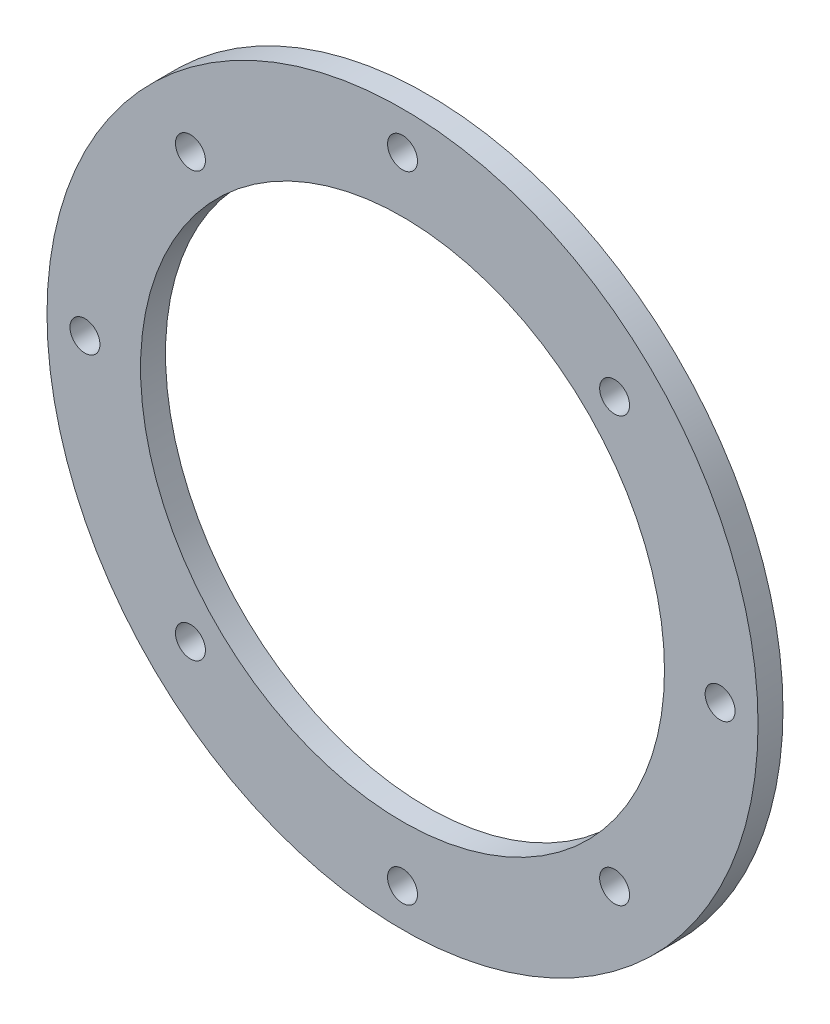
ISO-10303-21;
HEADER;
FILE_DESCRIPTION(('STEP AP214'),'2;1');
FILE_NAME('part.step','',(''),(''),'','','');
FILE_SCHEMA(('AUTOMOTIVE_DESIGN { 1 0 10303 214 1 1 1 1 }'));
ENDSEC;
DATA;
#1=APPLICATION_CONTEXT('core data for automotive mechanical design processes');
#2=APPLICATION_PROTOCOL_DEFINITION('international standard','automotive_design',2000,#1);
#3=PRODUCT_CONTEXT('',#1,'mechanical');
#4=PRODUCT('Part','Part','',(#3));
#5=PRODUCT_RELATED_PRODUCT_CATEGORY('part','',(#4));
#6=PRODUCT_DEFINITION_FORMATION('','',#4);
#7=PRODUCT_DEFINITION_CONTEXT('part definition',#1,'design');
#8=PRODUCT_DEFINITION('design','',#6,#7);
#9=PRODUCT_DEFINITION_SHAPE('','',#8);
#10=(LENGTH_UNIT() NAMED_UNIT(*) SI_UNIT(.MILLI.,.METRE.));
#11=(NAMED_UNIT(*) PLANE_ANGLE_UNIT() SI_UNIT($,.RADIAN.));
#12=(NAMED_UNIT(*) SI_UNIT($,.STERADIAN.) SOLID_ANGLE_UNIT());
#13=UNCERTAINTY_MEASURE_WITH_UNIT(LENGTH_MEASURE(1.E-05),#10,'distance_accuracy_value','');
#14=(GEOMETRIC_REPRESENTATION_CONTEXT(3) GLOBAL_UNCERTAINTY_ASSIGNED_CONTEXT((#13)) GLOBAL_UNIT_ASSIGNED_CONTEXT((#10,
#11,#12)) REPRESENTATION_CONTEXT('',''));
#15=CARTESIAN_POINT('',(0.,0.,0.));
#16=DIRECTION('',(0.,0.,1.));
#17=DIRECTION('',(1.,0.,0.));
#18=AXIS2_PLACEMENT_3D('',#15,#16,#17);
#19=CARTESIAN_POINT('',(0.,0.,2.));
#20=DIRECTION('',(0.,0.,1.));
#21=DIRECTION('',(1.,0.,0.));
#22=AXIS2_PLACEMENT_3D('',#19,#20,#21);
#23=PLANE('',#22);
#24=CARTESIAN_POINT('',(-17.,17.,2.));
#25=DIRECTION('',(0.,0.,1.));
#26=DIRECTION('',(1.,0.,0.));
#27=AXIS2_PLACEMENT_3D('',#24,#25,#26);
#28=CIRCLE('',#27,1.19999999999999);
#29=CARTESIAN_POINT('',(-15.8,17.,2.));
#30=VERTEX_POINT('',#29);
#31=EDGE_CURVE('E94',#30,#30,#28,.T.);
#32=ORIENTED_EDGE('',*,*,#31,.F.);
#33=EDGE_LOOP('',(#32));
#34=FACE_BOUND('',#33,.T.);
#35=CARTESIAN_POINT('',(17.,17.,2.));
#36=DIRECTION('',(0.,0.,1.));
#37=DIRECTION('',(1.,0.,0.));
#38=AXIS2_PLACEMENT_3D('',#35,#36,#37);
#39=CIRCLE('',#38,1.19999999999999);
#40=CARTESIAN_POINT('',(18.2,17.,2.));
#41=VERTEX_POINT('',#40);
#42=EDGE_CURVE('E88',#41,#41,#39,.T.);
#43=ORIENTED_EDGE('',*,*,#42,.F.);
#44=EDGE_LOOP('',(#43));
#45=FACE_BOUND('',#44,.T.);
#46=CARTESIAN_POINT('',(17.,-17.,2.));
#47=DIRECTION('',(0.,0.,1.));
#48=DIRECTION('',(1.,0.,0.));
#49=AXIS2_PLACEMENT_3D('',#46,#47,#48);
#50=CIRCLE('',#49,1.19999999999999);
#51=CARTESIAN_POINT('',(18.2,-17.,2.));
#52=VERTEX_POINT('',#51);
#53=EDGE_CURVE('E82',#52,#52,#50,.T.);
#54=ORIENTED_EDGE('',*,*,#53,.F.);
#55=EDGE_LOOP('',(#54));
#56=FACE_BOUND('',#55,.T.);
#57=CARTESIAN_POINT('',(-17.,-17.,2.));
#58=DIRECTION('',(0.,0.,1.));
#59=DIRECTION('',(1.,0.,0.));
#60=AXIS2_PLACEMENT_3D('',#57,#58,#59);
#61=CIRCLE('',#60,1.19999999999999);
#62=CARTESIAN_POINT('',(-15.8,-17.,2.));
#63=VERTEX_POINT('',#62);
#64=EDGE_CURVE('E76',#63,#63,#61,.T.);
#65=ORIENTED_EDGE('',*,*,#64,.F.);
#66=EDGE_LOOP('',(#65));
#67=FACE_BOUND('',#66,.T.);
#68=CARTESIAN_POINT('',(0.,25.4558441227157,2.));
#69=DIRECTION('',(0.,0.,1.));
#70=DIRECTION('',(1.,0.,0.));
#71=AXIS2_PLACEMENT_3D('',#68,#69,#70);
#72=CIRCLE('',#71,1.2);
#73=CARTESIAN_POINT('',(1.20000000000001,25.4558441227157,2.));
#74=VERTEX_POINT('',#73);
#75=EDGE_CURVE('E47',#74,#74,#72,.T.);
#76=ORIENTED_EDGE('',*,*,#75,.F.);
#77=EDGE_LOOP('',(#76));
#78=FACE_BOUND('',#77,.T.);
#79=CARTESIAN_POINT('',(25.4558441227157,0.,2.));
#80=DIRECTION('',(0.,0.,1.));
#81=DIRECTION('',(1.,0.,0.));
#82=AXIS2_PLACEMENT_3D('',#79,#80,#81);
#83=CIRCLE('',#82,1.2);
#84=CARTESIAN_POINT('',(26.6558441227157,0.,2.));
#85=VERTEX_POINT('',#84);
#86=EDGE_CURVE('E66',#85,#85,#83,.T.);
#87=ORIENTED_EDGE('',*,*,#86,.F.);
#88=EDGE_LOOP('',(#87));
#89=FACE_BOUND('',#88,.T.);
#90=CARTESIAN_POINT('',(-25.4558441227157,0.,2.));
#91=DIRECTION('',(0.,0.,1.));
#92=DIRECTION('',(1.,0.,0.));
#93=AXIS2_PLACEMENT_3D('',#90,#91,#92);
#94=CIRCLE('',#93,1.2);
#95=CARTESIAN_POINT('',(-24.2558441227157,0.,2.));
#96=VERTEX_POINT('',#95);
#97=EDGE_CURVE('E60',#96,#96,#94,.T.);
#98=ORIENTED_EDGE('',*,*,#97,.F.);
#99=EDGE_LOOP('',(#98));
#100=FACE_BOUND('',#99,.T.);
#101=CARTESIAN_POINT('',(0.,-25.4558441227157,2.));
#102=DIRECTION('',(0.,0.,1.));
#103=DIRECTION('',(1.,0.,0.));
#104=AXIS2_PLACEMENT_3D('',#101,#102,#103);
#105=CIRCLE('',#104,1.2);
#106=CARTESIAN_POINT('',(1.20000000000001,-25.4558441227157,2.));
#107=VERTEX_POINT('',#106);
#108=EDGE_CURVE('E53',#107,#107,#105,.T.);
#109=ORIENTED_EDGE('',*,*,#108,.F.);
#110=EDGE_LOOP('',(#109));
#111=FACE_BOUND('',#110,.T.);
#112=CARTESIAN_POINT('',(0.,0.,2.));
#113=DIRECTION('',(0.,0.,1.));
#114=DIRECTION('',(1.,0.,0.));
#115=AXIS2_PLACEMENT_3D('',#112,#113,#114);
#116=CIRCLE('',#115,28.5);
#117=CARTESIAN_POINT('',(28.5,0.,2.));
#118=VERTEX_POINT('',#117);
#119=EDGE_CURVE('E10',#118,#118,#116,.T.);
#120=ORIENTED_EDGE('',*,*,#119,.T.);
#121=EDGE_LOOP('',(#120));
#122=FACE_BOUND('',#121,.T.);
#123=CARTESIAN_POINT('',(0.,0.,2.));
#124=DIRECTION('',(0.,0.,1.));
#125=DIRECTION('',(1.,0.,0.));
#126=AXIS2_PLACEMENT_3D('',#123,#124,#125);
#127=CIRCLE('',#126,21.);
#128=CARTESIAN_POINT('',(21.,0.,2.));
#129=VERTEX_POINT('',#128);
#130=EDGE_CURVE('E42',#129,#129,#127,.T.);
#131=ORIENTED_EDGE('',*,*,#130,.F.);
#132=EDGE_LOOP('',(#131));
#133=FACE_BOUND('',#132,.T.);
#134=ADVANCED_FACE('F31',(#34,#45,#56,#67,#78,#89,#100,#111,#122,#133),#23,.T.);
#135=CARTESIAN_POINT('',(0.,0.,0.));
#136=DIRECTION('',(0.,0.,1.));
#137=DIRECTION('',(1.,0.,0.));
#138=AXIS2_PLACEMENT_3D('',#135,#136,#137);
#139=PLANE('',#138);
#140=CARTESIAN_POINT('',(-17.,17.,0.));
#141=DIRECTION('',(0.,0.,1.));
#142=DIRECTION('',(1.,0.,0.));
#143=AXIS2_PLACEMENT_3D('',#140,#141,#142);
#144=CIRCLE('',#143,1.2);
#145=CARTESIAN_POINT('',(-15.8,17.,0.));
#146=VERTEX_POINT('',#145);
#147=EDGE_CURVE('E91',#146,#146,#144,.T.);
#148=ORIENTED_EDGE('',*,*,#147,.T.);
#149=EDGE_LOOP('',(#148));
#150=FACE_BOUND('',#149,.T.);
#151=CARTESIAN_POINT('',(17.,17.,0.));
#152=DIRECTION('',(0.,0.,1.));
#153=DIRECTION('',(1.,0.,0.));
#154=AXIS2_PLACEMENT_3D('',#151,#152,#153);
#155=CIRCLE('',#154,1.2);
#156=CARTESIAN_POINT('',(18.2,17.,0.));
#157=VERTEX_POINT('',#156);
#158=EDGE_CURVE('E85',#157,#157,#155,.T.);
#159=ORIENTED_EDGE('',*,*,#158,.T.);
#160=EDGE_LOOP('',(#159));
#161=FACE_BOUND('',#160,.T.);
#162=CARTESIAN_POINT('',(17.,-17.,0.));
#163=DIRECTION('',(0.,0.,1.));
#164=DIRECTION('',(1.,0.,0.));
#165=AXIS2_PLACEMENT_3D('',#162,#163,#164);
#166=CIRCLE('',#165,1.2);
#167=CARTESIAN_POINT('',(18.2,-17.,0.));
#168=VERTEX_POINT('',#167);
#169=EDGE_CURVE('E79',#168,#168,#166,.T.);
#170=ORIENTED_EDGE('',*,*,#169,.T.);
#171=EDGE_LOOP('',(#170));
#172=FACE_BOUND('',#171,.T.);
#173=CARTESIAN_POINT('',(-17.,-17.,0.));
#174=DIRECTION('',(0.,0.,1.));
#175=DIRECTION('',(1.,0.,0.));
#176=AXIS2_PLACEMENT_3D('',#173,#174,#175);
#177=CIRCLE('',#176,1.2);
#178=CARTESIAN_POINT('',(-15.8,-17.,0.));
#179=VERTEX_POINT('',#178);
#180=EDGE_CURVE('E54',#179,#179,#177,.T.);
#181=ORIENTED_EDGE('',*,*,#180,.T.);
#182=EDGE_LOOP('',(#181));
#183=FACE_BOUND('',#182,.T.);
#184=CARTESIAN_POINT('',(0.,25.4558441227157,0.));
#185=DIRECTION('',(0.,0.,1.));
#186=DIRECTION('',(1.,0.,0.));
#187=AXIS2_PLACEMENT_3D('',#184,#185,#186);
#188=CIRCLE('',#187,1.2);
#189=CARTESIAN_POINT('',(1.20000000000001,25.4558441227157,0.));
#190=VERTEX_POINT('',#189);
#191=EDGE_CURVE('E69',#190,#190,#188,.T.);
#192=ORIENTED_EDGE('',*,*,#191,.T.);
#193=EDGE_LOOP('',(#192));
#194=FACE_BOUND('',#193,.T.);
#195=CARTESIAN_POINT('',(25.4558441227157,0.,0.));
#196=DIRECTION('',(0.,0.,1.));
#197=DIRECTION('',(1.,0.,0.));
#198=AXIS2_PLACEMENT_3D('',#195,#196,#197);
#199=CIRCLE('',#198,1.2);
#200=CARTESIAN_POINT('',(26.6558441227157,0.,0.));
#201=VERTEX_POINT('',#200);
#202=EDGE_CURVE('E63',#201,#201,#199,.T.);
#203=ORIENTED_EDGE('',*,*,#202,.T.);
#204=EDGE_LOOP('',(#203));
#205=FACE_BOUND('',#204,.T.);
#206=CARTESIAN_POINT('',(-25.4558441227157,0.,0.));
#207=DIRECTION('',(0.,0.,1.));
#208=DIRECTION('',(1.,0.,0.));
#209=AXIS2_PLACEMENT_3D('',#206,#207,#208);
#210=CIRCLE('',#209,1.2);
#211=CARTESIAN_POINT('',(-24.2558441227157,0.,0.));
#212=VERTEX_POINT('',#211);
#213=EDGE_CURVE('E57',#212,#212,#210,.T.);
#214=ORIENTED_EDGE('',*,*,#213,.T.);
#215=EDGE_LOOP('',(#214));
#216=FACE_BOUND('',#215,.T.);
#217=CARTESIAN_POINT('',(0.,-25.4558441227157,0.));
#218=DIRECTION('',(0.,0.,1.));
#219=DIRECTION('',(1.,0.,0.));
#220=AXIS2_PLACEMENT_3D('',#217,#218,#219);
#221=CIRCLE('',#220,1.2);
#222=CARTESIAN_POINT('',(1.20000000000001,-25.4558441227157,0.));
#223=VERTEX_POINT('',#222);
#224=EDGE_CURVE('E50',#223,#223,#221,.T.);
#225=ORIENTED_EDGE('',*,*,#224,.T.);
#226=EDGE_LOOP('',(#225));
#227=FACE_BOUND('',#226,.T.);
#228=CARTESIAN_POINT('',(0.,0.,0.));
#229=DIRECTION('',(0.,0.,1.));
#230=DIRECTION('',(1.,0.,0.));
#231=AXIS2_PLACEMENT_3D('',#228,#229,#230);
#232=CIRCLE('',#231,28.5);
#233=CARTESIAN_POINT('',(28.5,0.,0.));
#234=VERTEX_POINT('',#233);
#235=EDGE_CURVE('E35',#234,#234,#232,.T.);
#236=ORIENTED_EDGE('',*,*,#235,.F.);
#237=EDGE_LOOP('',(#236));
#238=FACE_BOUND('',#237,.T.);
#239=CARTESIAN_POINT('',(0.,0.,0.));
#240=DIRECTION('',(0.,0.,1.));
#241=DIRECTION('',(1.,0.,0.));
#242=AXIS2_PLACEMENT_3D('',#239,#240,#241);
#243=CIRCLE('',#242,21.);
#244=CARTESIAN_POINT('',(21.,0.,0.));
#245=VERTEX_POINT('',#244);
#246=EDGE_CURVE('E44',#245,#245,#243,.T.);
#247=ORIENTED_EDGE('',*,*,#246,.T.);
#248=EDGE_LOOP('',(#247));
#249=FACE_BOUND('',#248,.T.);
#250=ADVANCED_FACE('F102',(#150,#161,#172,#183,#194,#205,#216,#227,#238,#249),#139,.F.);
#251=CARTESIAN_POINT('',(0.,0.,2.));
#252=DIRECTION('',(0.,0.,-1.));
#253=DIRECTION('',(-1.,0.,0.));
#254=AXIS2_PLACEMENT_3D('',#251,#252,#253);
#255=CYLINDRICAL_SURFACE('',#254,28.5);
#256=ORIENTED_EDGE('',*,*,#119,.F.);
#257=EDGE_LOOP('',(#256));
#258=FACE_BOUND('',#257,.T.);
#259=ORIENTED_EDGE('',*,*,#235,.T.);
#260=EDGE_LOOP('',(#259));
#261=FACE_BOUND('',#260,.T.);
#262=ADVANCED_FACE('F33',(#258,#261),#255,.T.);
#263=CARTESIAN_POINT('',(0.,0.,2.));
#264=DIRECTION('',(0.,0.,-1.));
#265=DIRECTION('',(-1.,0.,0.));
#266=AXIS2_PLACEMENT_3D('',#263,#264,#265);
#267=CYLINDRICAL_SURFACE('',#266,21.);
#268=ORIENTED_EDGE('',*,*,#130,.T.);
#269=EDGE_LOOP('',(#268));
#270=FACE_BOUND('',#269,.T.);
#271=ORIENTED_EDGE('',*,*,#246,.F.);
#272=EDGE_LOOP('',(#271));
#273=FACE_BOUND('',#272,.T.);
#274=ADVANCED_FACE('F120',(#270,#273),#267,.F.);
#275=CARTESIAN_POINT('',(0.,-25.4558441227157,2.));
#276=DIRECTION('',(0.,0.,-1.));
#277=DIRECTION('',(-1.,0.,0.));
#278=AXIS2_PLACEMENT_3D('',#275,#276,#277);
#279=CYLINDRICAL_SURFACE('',#278,1.2);
#280=ORIENTED_EDGE('',*,*,#108,.T.);
#281=EDGE_LOOP('',(#280));
#282=FACE_BOUND('',#281,.T.);
#283=ORIENTED_EDGE('',*,*,#224,.F.);
#284=EDGE_LOOP('',(#283));
#285=FACE_BOUND('',#284,.T.);
#286=ADVANCED_FACE('F123',(#282,#285),#279,.F.);
#287=CARTESIAN_POINT('',(-25.4558441227157,0.,2.));
#288=DIRECTION('',(0.,0.,-1.));
#289=DIRECTION('',(-1.,0.,0.));
#290=AXIS2_PLACEMENT_3D('',#287,#288,#289);
#291=CYLINDRICAL_SURFACE('',#290,1.2);
#292=ORIENTED_EDGE('',*,*,#97,.T.);
#293=EDGE_LOOP('',(#292));
#294=FACE_BOUND('',#293,.T.);
#295=ORIENTED_EDGE('',*,*,#213,.F.);
#296=EDGE_LOOP('',(#295));
#297=FACE_BOUND('',#296,.T.);
#298=ADVANCED_FACE('F137',(#294,#297),#291,.F.);
#299=CARTESIAN_POINT('',(25.4558441227157,0.,2.));
#300=DIRECTION('',(0.,0.,-1.));
#301=DIRECTION('',(-1.,0.,0.));
#302=AXIS2_PLACEMENT_3D('',#299,#300,#301);
#303=CYLINDRICAL_SURFACE('',#302,1.2);
#304=ORIENTED_EDGE('',*,*,#86,.T.);
#305=EDGE_LOOP('',(#304));
#306=FACE_BOUND('',#305,.T.);
#307=ORIENTED_EDGE('',*,*,#202,.F.);
#308=EDGE_LOOP('',(#307));
#309=FACE_BOUND('',#308,.T.);
#310=ADVANCED_FACE('F141',(#306,#309),#303,.F.);
#311=CARTESIAN_POINT('',(0.,25.4558441227157,2.));
#312=DIRECTION('',(0.,0.,-1.));
#313=DIRECTION('',(-1.,0.,0.));
#314=AXIS2_PLACEMENT_3D('',#311,#312,#313);
#315=CYLINDRICAL_SURFACE('',#314,1.2);
#316=ORIENTED_EDGE('',*,*,#75,.T.);
#317=EDGE_LOOP('',(#316));
#318=FACE_BOUND('',#317,.T.);
#319=ORIENTED_EDGE('',*,*,#191,.F.);
#320=EDGE_LOOP('',(#319));
#321=FACE_BOUND('',#320,.T.);
#322=ADVANCED_FACE('F145',(#318,#321),#315,.F.);
#323=CARTESIAN_POINT('',(-17.,-17.,2.));
#324=DIRECTION('',(0.,0.,1.));
#325=DIRECTION('',(1.,0.,0.));
#326=AXIS2_PLACEMENT_3D('',#323,#324,#325);
#327=CYLINDRICAL_SURFACE('',#326,1.19999999999999);
#328=ORIENTED_EDGE('',*,*,#180,.F.);
#329=EDGE_LOOP('',(#328));
#330=FACE_BOUND('',#329,.T.);
#331=ORIENTED_EDGE('',*,*,#64,.T.);
#332=EDGE_LOOP('',(#331));
#333=FACE_BOUND('',#332,.T.);
#334=ADVANCED_FACE('F149',(#330,#333),#327,.F.);
#335=CARTESIAN_POINT('',(17.,-17.,2.));
#336=DIRECTION('',(0.,0.,1.));
#337=DIRECTION('',(1.,0.,0.));
#338=AXIS2_PLACEMENT_3D('',#335,#336,#337);
#339=CYLINDRICAL_SURFACE('',#338,1.19999999999999);
#340=ORIENTED_EDGE('',*,*,#169,.F.);
#341=EDGE_LOOP('',(#340));
#342=FACE_BOUND('',#341,.T.);
#343=ORIENTED_EDGE('',*,*,#53,.T.);
#344=EDGE_LOOP('',(#343));
#345=FACE_BOUND('',#344,.T.);
#346=ADVANCED_FACE('F153',(#342,#345),#339,.F.);
#347=CARTESIAN_POINT('',(17.,17.,2.));
#348=DIRECTION('',(0.,0.,1.));
#349=DIRECTION('',(1.,0.,0.));
#350=AXIS2_PLACEMENT_3D('',#347,#348,#349);
#351=CYLINDRICAL_SURFACE('',#350,1.19999999999999);
#352=ORIENTED_EDGE('',*,*,#158,.F.);
#353=EDGE_LOOP('',(#352));
#354=FACE_BOUND('',#353,.T.);
#355=ORIENTED_EDGE('',*,*,#42,.T.);
#356=EDGE_LOOP('',(#355));
#357=FACE_BOUND('',#356,.T.);
#358=ADVANCED_FACE('F157',(#354,#357),#351,.F.);
#359=CARTESIAN_POINT('',(-17.,17.,2.));
#360=DIRECTION('',(0.,0.,1.));
#361=DIRECTION('',(1.,0.,0.));
#362=AXIS2_PLACEMENT_3D('',#359,#360,#361);
#363=CYLINDRICAL_SURFACE('',#362,1.19999999999999);
#364=ORIENTED_EDGE('',*,*,#147,.F.);
#365=EDGE_LOOP('',(#364));
#366=FACE_BOUND('',#365,.T.);
#367=ORIENTED_EDGE('',*,*,#31,.T.);
#368=EDGE_LOOP('',(#367));
#369=FACE_BOUND('',#368,.T.);
#370=ADVANCED_FACE('F98',(#366,#369),#363,.F.);
#371=CLOSED_SHELL('',(#134,#250,#262,#274,#286,#298,#310,#322,#334,#346,#358,#370));
#372=MANIFOLD_SOLID_BREP('B2',#371);
#373=ADVANCED_BREP_SHAPE_REPRESENTATION('',(#18,#372),#14);
#374=SHAPE_DEFINITION_REPRESENTATION(#9,#373);
ENDSEC;
END-ISO-10303-21;
